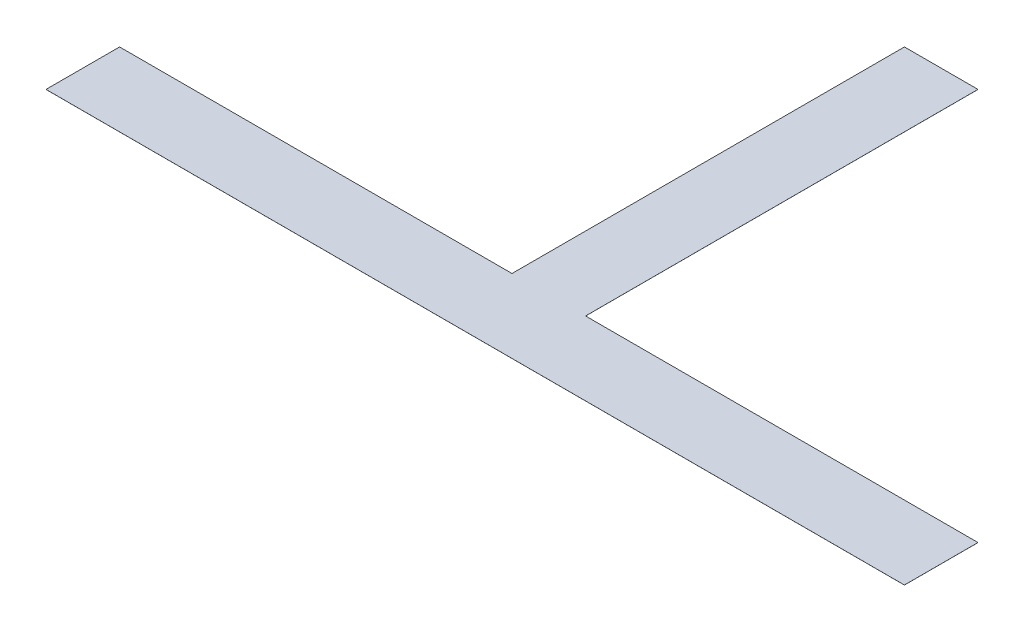
ISO-10303-21;
HEADER;
FILE_DESCRIPTION(('STEP AP214'),'2;1');
FILE_NAME('part.step','',(''),(''),'','','');
FILE_SCHEMA(('AUTOMOTIVE_DESIGN { 1 0 10303 214 1 1 1 1 }'));
ENDSEC;
DATA;
#1=APPLICATION_CONTEXT('core data for automotive mechanical design processes');
#2=APPLICATION_PROTOCOL_DEFINITION('international standard','automotive_design',2000,#1);
#3=PRODUCT_CONTEXT('',#1,'mechanical');
#4=PRODUCT('Part','Part','',(#3));
#5=PRODUCT_RELATED_PRODUCT_CATEGORY('part','',(#4));
#6=PRODUCT_DEFINITION_FORMATION('','',#4);
#7=PRODUCT_DEFINITION_CONTEXT('part definition',#1,'design');
#8=PRODUCT_DEFINITION('design','',#6,#7);
#9=PRODUCT_DEFINITION_SHAPE('','',#8);
#10=(LENGTH_UNIT() NAMED_UNIT(*) SI_UNIT(.MILLI.,.METRE.));
#11=(NAMED_UNIT(*) PLANE_ANGLE_UNIT() SI_UNIT($,.RADIAN.));
#12=(NAMED_UNIT(*) SI_UNIT($,.STERADIAN.) SOLID_ANGLE_UNIT());
#13=UNCERTAINTY_MEASURE_WITH_UNIT(LENGTH_MEASURE(1.E-05),#10,'distance_accuracy_value','');
#14=(GEOMETRIC_REPRESENTATION_CONTEXT(3) GLOBAL_UNCERTAINTY_ASSIGNED_CONTEXT((#13)) GLOBAL_UNIT_ASSIGNED_CONTEXT((#10,
#11,#12)) REPRESENTATION_CONTEXT('',''));
#15=CARTESIAN_POINT('',(0.,0.,0.));
#16=DIRECTION('',(0.,0.,1.));
#17=DIRECTION('',(1.,0.,0.));
#18=AXIS2_PLACEMENT_3D('',#15,#16,#17);
#19=CARTESIAN_POINT('',(0.,0.02,72.5));
#20=DIRECTION('',(0.,0.,-1.));
#21=DIRECTION('',(-1.,0.,0.));
#22=AXIS2_PLACEMENT_3D('',#19,#20,#21);
#23=PLANE('',#22);
#24=DIRECTION('',(1.,0.,0.));
#25=VECTOR('',#24,1.);
#26=CARTESIAN_POINT('',(0.,0.,72.5));
#27=LINE('',#26,#25);
#28=CARTESIAN_POINT('',(15.,0.,72.5));
#29=VERTEX_POINT('',#28);
#30=CARTESIAN_POINT('',(175.,0.,72.5));
#31=VERTEX_POINT('',#30);
#32=EDGE_CURVE('E130',#29,#31,#27,.T.);
#33=ORIENTED_EDGE('',*,*,#32,.F.);
#34=DIRECTION('',(0.,-1.,0.));
#35=VECTOR('',#34,1.);
#36=CARTESIAN_POINT('',(15.,0.02,72.5));
#37=LINE('',#36,#35);
#38=CARTESIAN_POINT('',(15.,0.02,72.5));
#39=VERTEX_POINT('',#38);
#40=EDGE_CURVE('E11',#39,#29,#37,.T.);
#41=ORIENTED_EDGE('',*,*,#40,.F.);
#42=DIRECTION('',(1.,0.,0.));
#43=VECTOR('',#42,1.);
#44=CARTESIAN_POINT('',(0.,0.02,72.5));
#45=LINE('',#44,#43);
#46=CARTESIAN_POINT('',(175.,0.02,72.5));
#47=VERTEX_POINT('',#46);
#48=EDGE_CURVE('E148',#39,#47,#45,.T.);
#49=ORIENTED_EDGE('',*,*,#48,.T.);
#50=DIRECTION('',(0.,-1.,0.));
#51=VECTOR('',#50,1.);
#52=CARTESIAN_POINT('',(175.,0.02,72.5));
#53=LINE('',#52,#51);
#54=EDGE_CURVE('E51',#47,#31,#53,.T.);
#55=ORIENTED_EDGE('',*,*,#54,.T.);
#56=EDGE_LOOP('',(#33,#41,#49,#55));
#57=FACE_BOUND('',#56,.T.);
#58=ADVANCED_FACE('F35',(#57),#23,.T.);
#59=CARTESIAN_POINT('',(15.,0.02,0.));
#60=DIRECTION('',(-1.,0.,0.));
#61=DIRECTION('',(0.,0.,1.));
#62=AXIS2_PLACEMENT_3D('',#59,#60,#61);
#63=PLANE('',#62);
#64=DIRECTION('',(0.,0.,-1.));
#65=VECTOR('',#64,1.);
#66=CARTESIAN_POINT('',(15.,0.,0.));
#67=LINE('',#66,#65);
#68=CARTESIAN_POINT('',(15.,0.,-87.5));
#69=VERTEX_POINT('',#68);
#70=EDGE_CURVE('E132',#29,#69,#67,.T.);
#71=ORIENTED_EDGE('',*,*,#70,.T.);
#72=DIRECTION('',(0.,-1.,0.));
#73=VECTOR('',#72,1.);
#74=CARTESIAN_POINT('',(15.,0.02,-87.5));
#75=LINE('',#74,#73);
#76=CARTESIAN_POINT('',(15.,0.02,-87.5));
#77=VERTEX_POINT('',#76);
#78=EDGE_CURVE('E43',#77,#69,#75,.T.);
#79=ORIENTED_EDGE('',*,*,#78,.F.);
#80=DIRECTION('',(0.,0.,-1.));
#81=VECTOR('',#80,1.);
#82=CARTESIAN_POINT('',(15.,0.02,0.));
#83=LINE('',#82,#81);
#84=EDGE_CURVE('E174',#39,#77,#83,.T.);
#85=ORIENTED_EDGE('',*,*,#84,.F.);
#86=ORIENTED_EDGE('',*,*,#40,.T.);
#87=EDGE_LOOP('',(#71,#79,#85,#86));
#88=FACE_BOUND('',#87,.T.);
#89=ADVANCED_FACE('F189',(#88),#63,.F.);
#90=CARTESIAN_POINT('',(0.,0.02,-87.5));
#91=DIRECTION('',(0.,0.,1.));
#92=DIRECTION('',(1.,0.,0.));
#93=AXIS2_PLACEMENT_3D('',#90,#91,#92);
#94=PLANE('',#93);
#95=DIRECTION('',(-1.,0.,0.));
#96=VECTOR('',#95,1.);
#97=CARTESIAN_POINT('',(0.,0.,-87.5));
#98=LINE('',#97,#96);
#99=CARTESIAN_POINT('',(-15.,0.,-87.5));
#100=VERTEX_POINT('',#99);
#101=EDGE_CURVE('E134',#69,#100,#98,.T.);
#102=ORIENTED_EDGE('',*,*,#101,.T.);
#103=DIRECTION('',(0.,-1.,0.));
#104=VECTOR('',#103,1.);
#105=CARTESIAN_POINT('',(-15.,0.02,-87.5));
#106=LINE('',#105,#104);
#107=CARTESIAN_POINT('',(-15.,0.02,-87.5));
#108=VERTEX_POINT('',#107);
#109=EDGE_CURVE('E154',#108,#100,#106,.T.);
#110=ORIENTED_EDGE('',*,*,#109,.F.);
#111=DIRECTION('',(-1.,0.,0.));
#112=VECTOR('',#111,1.);
#113=CARTESIAN_POINT('',(0.,0.02,-87.5));
#114=LINE('',#113,#112);
#115=EDGE_CURVE('E162',#77,#108,#114,.T.);
#116=ORIENTED_EDGE('',*,*,#115,.F.);
#117=ORIENTED_EDGE('',*,*,#78,.T.);
#118=EDGE_LOOP('',(#102,#110,#116,#117));
#119=FACE_BOUND('',#118,.T.);
#120=ADVANCED_FACE('F160',(#119),#94,.F.);
#121=CARTESIAN_POINT('',(-15.,0.02,0.));
#122=DIRECTION('',(-1.,0.,0.));
#123=DIRECTION('',(0.,0.,1.));
#124=AXIS2_PLACEMENT_3D('',#121,#122,#123);
#125=PLANE('',#124);
#126=DIRECTION('',(0.,0.,-1.));
#127=VECTOR('',#126,1.);
#128=CARTESIAN_POINT('',(-15.,0.,0.));
#129=LINE('',#128,#127);
#130=CARTESIAN_POINT('',(-15.,0.,72.5));
#131=VERTEX_POINT('',#130);
#132=EDGE_CURVE('E137',#131,#100,#129,.T.);
#133=ORIENTED_EDGE('',*,*,#132,.F.);
#134=DIRECTION('',(0.,-1.,0.));
#135=VECTOR('',#134,1.);
#136=CARTESIAN_POINT('',(-15.,0.02,72.5));
#137=LINE('',#136,#135);
#138=CARTESIAN_POINT('',(-15.,0.02,72.5));
#139=VERTEX_POINT('',#138);
#140=EDGE_CURVE('E152',#139,#131,#137,.T.);
#141=ORIENTED_EDGE('',*,*,#140,.F.);
#142=DIRECTION('',(0.,0.,-1.));
#143=VECTOR('',#142,1.);
#144=CARTESIAN_POINT('',(-15.,0.02,0.));
#145=LINE('',#144,#143);
#146=EDGE_CURVE('E172',#139,#108,#145,.T.);
#147=ORIENTED_EDGE('',*,*,#146,.T.);
#148=ORIENTED_EDGE('',*,*,#109,.T.);
#149=EDGE_LOOP('',(#133,#141,#147,#148));
#150=FACE_BOUND('',#149,.T.);
#151=ADVANCED_FACE('F170',(#150),#125,.T.);
#152=CARTESIAN_POINT('',(0.,0.02,72.5));
#153=DIRECTION('',(0.,0.,1.));
#154=DIRECTION('',(1.,0.,0.));
#155=AXIS2_PLACEMENT_3D('',#152,#153,#154);
#156=PLANE('',#155);
#157=DIRECTION('',(-1.,0.,0.));
#158=VECTOR('',#157,1.);
#159=CARTESIAN_POINT('',(0.,0.,72.5));
#160=LINE('',#159,#158);
#161=CARTESIAN_POINT('',(-175.,0.,72.5));
#162=VERTEX_POINT('',#161);
#163=EDGE_CURVE('E140',#131,#162,#160,.T.);
#164=ORIENTED_EDGE('',*,*,#163,.T.);
#165=DIRECTION('',(0.,-1.,0.));
#166=VECTOR('',#165,1.);
#167=CARTESIAN_POINT('',(-175.,0.02,72.5));
#168=LINE('',#167,#166);
#169=CARTESIAN_POINT('',(-175.,0.02,72.5));
#170=VERTEX_POINT('',#169);
#171=EDGE_CURVE('E122',#170,#162,#168,.T.);
#172=ORIENTED_EDGE('',*,*,#171,.F.);
#173=DIRECTION('',(-1.,0.,0.));
#174=VECTOR('',#173,1.);
#175=CARTESIAN_POINT('',(0.,0.02,72.5));
#176=LINE('',#175,#174);
#177=EDGE_CURVE('E110',#139,#170,#176,.T.);
#178=ORIENTED_EDGE('',*,*,#177,.F.);
#179=ORIENTED_EDGE('',*,*,#140,.T.);
#180=EDGE_LOOP('',(#164,#172,#178,#179));
#181=FACE_BOUND('',#180,.T.);
#182=ADVANCED_FACE('F200',(#181),#156,.F.);
#183=CARTESIAN_POINT('',(-175.,0.02,0.));
#184=DIRECTION('',(1.,0.,0.));
#185=DIRECTION('',(0.,0.,-1.));
#186=AXIS2_PLACEMENT_3D('',#183,#184,#185);
#187=PLANE('',#186);
#188=DIRECTION('',(0.,0.,1.));
#189=VECTOR('',#188,1.);
#190=CARTESIAN_POINT('',(-175.,0.,0.));
#191=LINE('',#190,#189);
#192=CARTESIAN_POINT('',(-175.,0.,102.5));
#193=VERTEX_POINT('',#192);
#194=EDGE_CURVE('E119',#162,#193,#191,.T.);
#195=ORIENTED_EDGE('',*,*,#194,.T.);
#196=DIRECTION('',(0.,-1.,0.));
#197=VECTOR('',#196,1.);
#198=CARTESIAN_POINT('',(-175.,0.02,102.5));
#199=LINE('',#198,#197);
#200=CARTESIAN_POINT('',(-175.,0.02,102.5));
#201=VERTEX_POINT('',#200);
#202=EDGE_CURVE('E116',#201,#193,#199,.T.);
#203=ORIENTED_EDGE('',*,*,#202,.F.);
#204=DIRECTION('',(0.,0.,1.));
#205=VECTOR('',#204,1.);
#206=CARTESIAN_POINT('',(-175.,0.02,0.));
#207=LINE('',#206,#205);
#208=EDGE_CURVE('E101',#170,#201,#207,.T.);
#209=ORIENTED_EDGE('',*,*,#208,.F.);
#210=ORIENTED_EDGE('',*,*,#171,.T.);
#211=EDGE_LOOP('',(#195,#203,#209,#210));
#212=FACE_BOUND('',#211,.T.);
#213=ADVANCED_FACE('F117',(#212),#187,.F.);
#214=CARTESIAN_POINT('',(0.,0.02,102.5));
#215=DIRECTION('',(0.,0.,1.));
#216=DIRECTION('',(1.,0.,0.));
#217=AXIS2_PLACEMENT_3D('',#214,#215,#216);
#218=PLANE('',#217);
#219=DIRECTION('',(-1.,0.,0.));
#220=VECTOR('',#219,1.);
#221=CARTESIAN_POINT('',(0.,0.,102.5));
#222=LINE('',#221,#220);
#223=CARTESIAN_POINT('',(175.,0.,102.5));
#224=VERTEX_POINT('',#223);
#225=EDGE_CURVE('E143',#224,#193,#222,.T.);
#226=ORIENTED_EDGE('',*,*,#225,.F.);
#227=DIRECTION('',(0.,-1.,0.));
#228=VECTOR('',#227,1.);
#229=CARTESIAN_POINT('',(175.,0.02,102.5));
#230=LINE('',#229,#228);
#231=CARTESIAN_POINT('',(175.,0.02,102.5));
#232=VERTEX_POINT('',#231);
#233=EDGE_CURVE('E76',#232,#224,#230,.T.);
#234=ORIENTED_EDGE('',*,*,#233,.F.);
#235=DIRECTION('',(-1.,0.,0.));
#236=VECTOR('',#235,1.);
#237=CARTESIAN_POINT('',(0.,0.02,102.5));
#238=LINE('',#237,#236);
#239=EDGE_CURVE('E107',#232,#201,#238,.T.);
#240=ORIENTED_EDGE('',*,*,#239,.T.);
#241=ORIENTED_EDGE('',*,*,#202,.T.);
#242=EDGE_LOOP('',(#226,#234,#240,#241));
#243=FACE_BOUND('',#242,.T.);
#244=ADVANCED_FACE('F124',(#243),#218,.T.);
#245=CARTESIAN_POINT('',(175.,0.02,0.));
#246=DIRECTION('',(1.,0.,0.));
#247=DIRECTION('',(0.,0.,-1.));
#248=AXIS2_PLACEMENT_3D('',#245,#246,#247);
#249=PLANE('',#248);
#250=DIRECTION('',(0.,0.,1.));
#251=VECTOR('',#250,1.);
#252=CARTESIAN_POINT('',(175.,0.,0.));
#253=LINE('',#252,#251);
#254=EDGE_CURVE('E145',#31,#224,#253,.T.);
#255=ORIENTED_EDGE('',*,*,#254,.F.);
#256=ORIENTED_EDGE('',*,*,#54,.F.);
#257=DIRECTION('',(0.,0.,1.));
#258=VECTOR('',#257,1.);
#259=CARTESIAN_POINT('',(175.,0.02,0.));
#260=LINE('',#259,#258);
#261=EDGE_CURVE('E125',#47,#232,#260,.T.);
#262=ORIENTED_EDGE('',*,*,#261,.T.);
#263=ORIENTED_EDGE('',*,*,#233,.T.);
#264=EDGE_LOOP('',(#255,#256,#262,#263));
#265=FACE_BOUND('',#264,.T.);
#266=ADVANCED_FACE('F178',(#265),#249,.T.);
#267=CARTESIAN_POINT('',(0.,0.02,0.));
#268=DIRECTION('',(0.,1.,0.));
#269=DIRECTION('',(0.,0.,1.));
#270=AXIS2_PLACEMENT_3D('',#267,#268,#269);
#271=PLANE('',#270);
#272=ORIENTED_EDGE('',*,*,#48,.F.);
#273=ORIENTED_EDGE('',*,*,#84,.T.);
#274=ORIENTED_EDGE('',*,*,#115,.T.);
#275=ORIENTED_EDGE('',*,*,#146,.F.);
#276=ORIENTED_EDGE('',*,*,#177,.T.);
#277=ORIENTED_EDGE('',*,*,#208,.T.);
#278=ORIENTED_EDGE('',*,*,#239,.F.);
#279=ORIENTED_EDGE('',*,*,#261,.F.);
#280=EDGE_LOOP('',(#272,#273,#274,#275,#276,#277,#278,#279));
#281=FACE_BOUND('',#280,.T.);
#282=ADVANCED_FACE('F104',(#281),#271,.T.);
#283=CARTESIAN_POINT('',(0.,0.,0.));
#284=DIRECTION('',(0.,1.,0.));
#285=DIRECTION('',(0.,0.,1.));
#286=AXIS2_PLACEMENT_3D('',#283,#284,#285);
#287=PLANE('',#286);
#288=ORIENTED_EDGE('',*,*,#32,.T.);
#289=ORIENTED_EDGE('',*,*,#254,.T.);
#290=ORIENTED_EDGE('',*,*,#225,.T.);
#291=ORIENTED_EDGE('',*,*,#194,.F.);
#292=ORIENTED_EDGE('',*,*,#163,.F.);
#293=ORIENTED_EDGE('',*,*,#132,.T.);
#294=ORIENTED_EDGE('',*,*,#101,.F.);
#295=ORIENTED_EDGE('',*,*,#70,.F.);
#296=EDGE_LOOP('',(#288,#289,#290,#291,#292,#293,#294,#295));
#297=FACE_BOUND('',#296,.T.);
#298=ADVANCED_FACE('F166',(#297),#287,.F.);
#299=CLOSED_SHELL('',(#58,#89,#120,#151,#182,#213,#244,#266,#282,#298));
#300=MANIFOLD_SOLID_BREP('B2',#299);
#301=ADVANCED_BREP_SHAPE_REPRESENTATION('',(#18,#300),#14);
#302=SHAPE_DEFINITION_REPRESENTATION(#9,#301);
ENDSEC;
END-ISO-10303-21;
